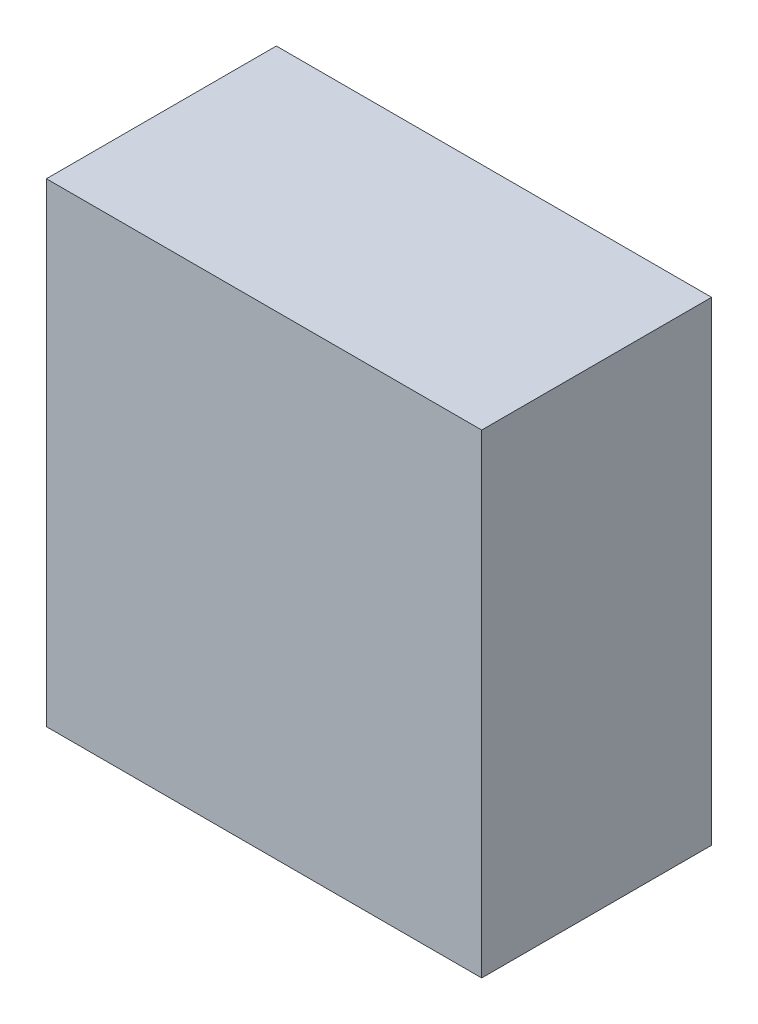
ISO-10303-21;
HEADER;
FILE_DESCRIPTION(('STEP AP214'),'2;1');
FILE_NAME('part.step','',(''),(''),'','','');
FILE_SCHEMA(('AUTOMOTIVE_DESIGN { 1 0 10303 214 1 1 1 1 }'));
ENDSEC;
DATA;
#1=APPLICATION_CONTEXT('core data for automotive mechanical design processes');
#2=APPLICATION_PROTOCOL_DEFINITION('international standard','automotive_design',2000,#1);
#3=PRODUCT_CONTEXT('',#1,'mechanical');
#4=PRODUCT('Part','Part','',(#3));
#5=PRODUCT_RELATED_PRODUCT_CATEGORY('part','',(#4));
#6=PRODUCT_DEFINITION_FORMATION('','',#4);
#7=PRODUCT_DEFINITION_CONTEXT('part definition',#1,'design');
#8=PRODUCT_DEFINITION('design','',#6,#7);
#9=PRODUCT_DEFINITION_SHAPE('','',#8);
#10=(LENGTH_UNIT() NAMED_UNIT(*) SI_UNIT(.MILLI.,.METRE.));
#11=(NAMED_UNIT(*) PLANE_ANGLE_UNIT() SI_UNIT($,.RADIAN.));
#12=(NAMED_UNIT(*) SI_UNIT($,.STERADIAN.) SOLID_ANGLE_UNIT());
#13=UNCERTAINTY_MEASURE_WITH_UNIT(LENGTH_MEASURE(1.E-05),#10,'distance_accuracy_value','');
#14=(GEOMETRIC_REPRESENTATION_CONTEXT(3) GLOBAL_UNCERTAINTY_ASSIGNED_CONTEXT((#13)) GLOBAL_UNIT_ASSIGNED_CONTEXT((#10,
#11,#12)) REPRESENTATION_CONTEXT('',''));
#15=CARTESIAN_POINT('',(0.,0.,0.));
#16=DIRECTION('',(0.,0.,1.));
#17=DIRECTION('',(1.,0.,0.));
#18=AXIS2_PLACEMENT_3D('',#15,#16,#17);
#19=CARTESIAN_POINT('',(6.84500028,4.98499892,0.));
#20=DIRECTION('',(1.,0.,0.));
#21=DIRECTION('',(0.,-1.,0.));
#22=AXIS2_PLACEMENT_3D('',#19,#20,#21);
#23=PLANE('',#22);
#24=DIRECTION('',(0.,0.,1.));
#25=VECTOR('',#24,1.);
#26=CARTESIAN_POINT('',(6.84500028,4.98499892,0.));
#27=LINE('',#26,#25);
#28=CARTESIAN_POINT('',(6.84500028,4.98499892,0.));
#29=VERTEX_POINT('',#28);
#30=CARTESIAN_POINT('',(6.84500028,4.98499892,4.8300005));
#31=VERTEX_POINT('',#30);
#32=EDGE_CURVE('E10',#29,#31,#27,.T.);
#33=ORIENTED_EDGE('',*,*,#32,.T.);
#34=DIRECTION('',(0.,-1.,0.));
#35=VECTOR('',#34,1.);
#36=CARTESIAN_POINT('',(6.84500028,4.98499892,4.8300005));
#37=LINE('',#36,#35);
#38=CARTESIAN_POINT('',(6.84500028,-4.98499892,4.8300005));
#39=VERTEX_POINT('',#38);
#40=EDGE_CURVE('E23',#31,#39,#37,.T.);
#41=ORIENTED_EDGE('',*,*,#40,.T.);
#42=DIRECTION('',(0.,0.,1.));
#43=VECTOR('',#42,1.);
#44=CARTESIAN_POINT('',(6.84500028,-4.98499892,0.));
#45=LINE('',#44,#43);
#46=CARTESIAN_POINT('',(6.84500028,-4.98499892,0.));
#47=VERTEX_POINT('',#46);
#48=EDGE_CURVE('E83',#47,#39,#45,.T.);
#49=ORIENTED_EDGE('',*,*,#48,.F.);
#50=DIRECTION('',(0.,-1.,0.));
#51=VECTOR('',#50,1.);
#52=CARTESIAN_POINT('',(6.84500028,4.98499892,0.));
#53=LINE('',#52,#51);
#54=EDGE_CURVE('E81',#29,#47,#53,.T.);
#55=ORIENTED_EDGE('',*,*,#54,.F.);
#56=EDGE_LOOP('',(#33,#41,#49,#55));
#57=FACE_BOUND('',#56,.T.);
#58=ADVANCED_FACE('F16',(#57),#23,.T.);
#59=CARTESIAN_POINT('',(6.84500028,-4.98499892,0.));
#60=DIRECTION('',(0.,-1.,0.));
#61=DIRECTION('',(-1.,0.,0.));
#62=AXIS2_PLACEMENT_3D('',#59,#60,#61);
#63=PLANE('',#62);
#64=ORIENTED_EDGE('',*,*,#48,.T.);
#65=DIRECTION('',(-1.,0.,0.));
#66=VECTOR('',#65,1.);
#67=CARTESIAN_POINT('',(6.84500028,-4.98499892,4.8300005));
#68=LINE('',#67,#66);
#69=CARTESIAN_POINT('',(-2.30000048,-4.98499892,4.8300005));
#70=VERTEX_POINT('',#69);
#71=EDGE_CURVE('E79',#39,#70,#68,.T.);
#72=ORIENTED_EDGE('',*,*,#71,.T.);
#73=DIRECTION('',(0.,0.,1.));
#74=VECTOR('',#73,1.);
#75=CARTESIAN_POINT('',(-2.30000048,-4.98499892,0.));
#76=LINE('',#75,#74);
#77=CARTESIAN_POINT('',(-2.30000048,-4.98499892,0.));
#78=VERTEX_POINT('',#77);
#79=EDGE_CURVE('E77',#78,#70,#76,.T.);
#80=ORIENTED_EDGE('',*,*,#79,.F.);
#81=DIRECTION('',(-1.,0.,0.));
#82=VECTOR('',#81,1.);
#83=CARTESIAN_POINT('',(6.84500028,-4.98499892,0.));
#84=LINE('',#83,#82);
#85=EDGE_CURVE('E67',#47,#78,#84,.T.);
#86=ORIENTED_EDGE('',*,*,#85,.F.);
#87=EDGE_LOOP('',(#64,#72,#80,#86));
#88=FACE_BOUND('',#87,.T.);
#89=ADVANCED_FACE('F90',(#88),#63,.T.);
#90=CARTESIAN_POINT('',(-2.30000048,-4.98499892,0.));
#91=DIRECTION('',(-1.,0.,0.));
#92=DIRECTION('',(0.,1.,0.));
#93=AXIS2_PLACEMENT_3D('',#90,#91,#92);
#94=PLANE('',#93);
#95=ORIENTED_EDGE('',*,*,#79,.T.);
#96=DIRECTION('',(0.,1.,0.));
#97=VECTOR('',#96,1.);
#98=CARTESIAN_POINT('',(-2.30000048,-4.98499892,4.8300005));
#99=LINE('',#98,#97);
#100=CARTESIAN_POINT('',(-2.30000048,4.98499892,4.8300005));
#101=VERTEX_POINT('',#100);
#102=EDGE_CURVE('E59',#70,#101,#99,.T.);
#103=ORIENTED_EDGE('',*,*,#102,.T.);
#104=DIRECTION('',(0.,0.,1.));
#105=VECTOR('',#104,1.);
#106=CARTESIAN_POINT('',(-2.30000048,4.98499892,0.));
#107=LINE('',#106,#105);
#108=CARTESIAN_POINT('',(-2.30000048,4.98499892,0.));
#109=VERTEX_POINT('',#108);
#110=EDGE_CURVE('E53',#109,#101,#107,.T.);
#111=ORIENTED_EDGE('',*,*,#110,.F.);
#112=DIRECTION('',(0.,1.,0.));
#113=VECTOR('',#112,1.);
#114=CARTESIAN_POINT('',(-2.30000048,-4.98499892,0.));
#115=LINE('',#114,#113);
#116=EDGE_CURVE('E57',#78,#109,#115,.T.);
#117=ORIENTED_EDGE('',*,*,#116,.F.);
#118=EDGE_LOOP('',(#95,#103,#111,#117));
#119=FACE_BOUND('',#118,.T.);
#120=ADVANCED_FACE('F56',(#119),#94,.T.);
#121=CARTESIAN_POINT('',(-2.30000048,4.98499892,0.));
#122=DIRECTION('',(0.,1.,0.));
#123=DIRECTION('',(1.,0.,0.));
#124=AXIS2_PLACEMENT_3D('',#121,#122,#123);
#125=PLANE('',#124);
#126=ORIENTED_EDGE('',*,*,#110,.T.);
#127=DIRECTION('',(1.,0.,0.));
#128=VECTOR('',#127,1.);
#129=CARTESIAN_POINT('',(-2.30000048,4.98499892,4.8300005));
#130=LINE('',#129,#128);
#131=EDGE_CURVE('E69',#101,#31,#130,.T.);
#132=ORIENTED_EDGE('',*,*,#131,.T.);
#133=ORIENTED_EDGE('',*,*,#32,.F.);
#134=DIRECTION('',(1.,0.,0.));
#135=VECTOR('',#134,1.);
#136=CARTESIAN_POINT('',(-2.30000048,4.98499892,0.));
#137=LINE('',#136,#135);
#138=EDGE_CURVE('E65',#109,#29,#137,.T.);
#139=ORIENTED_EDGE('',*,*,#138,.F.);
#140=EDGE_LOOP('',(#126,#132,#133,#139));
#141=FACE_BOUND('',#140,.T.);
#142=ADVANCED_FACE('F71',(#141),#125,.T.);
#143=CARTESIAN_POINT('',(2.2724999,0.,0.));
#144=DIRECTION('',(0.,0.,-1.));
#145=DIRECTION('',(0.,1.,0.));
#146=AXIS2_PLACEMENT_3D('',#143,#144,#145);
#147=PLANE('',#146);
#148=ORIENTED_EDGE('',*,*,#54,.T.);
#149=ORIENTED_EDGE('',*,*,#85,.T.);
#150=ORIENTED_EDGE('',*,*,#116,.T.);
#151=ORIENTED_EDGE('',*,*,#138,.T.);
#152=EDGE_LOOP('',(#148,#149,#150,#151));
#153=FACE_BOUND('',#152,.T.);
#154=ADVANCED_FACE('F64',(#153),#147,.T.);
#155=CARTESIAN_POINT('',(2.2724999,0.,4.8300005));
#156=DIRECTION('',(0.,0.,-1.));
#157=DIRECTION('',(0.,1.,0.));
#158=AXIS2_PLACEMENT_3D('',#155,#156,#157);
#159=PLANE('',#158);
#160=ORIENTED_EDGE('',*,*,#131,.F.);
#161=ORIENTED_EDGE('',*,*,#102,.F.);
#162=ORIENTED_EDGE('',*,*,#71,.F.);
#163=ORIENTED_EDGE('',*,*,#40,.F.);
#164=EDGE_LOOP('',(#160,#161,#162,#163));
#165=FACE_BOUND('',#164,.T.);
#166=ADVANCED_FACE('F88',(#165),#159,.F.);
#167=CLOSED_SHELL('',(#58,#89,#120,#142,#154,#166));
#168=MANIFOLD_SOLID_BREP('B1',#167);
#169=ADVANCED_BREP_SHAPE_REPRESENTATION('',(#18,#168),#14);
#170=SHAPE_DEFINITION_REPRESENTATION(#9,#169);
ENDSEC;
END-ISO-10303-21;
